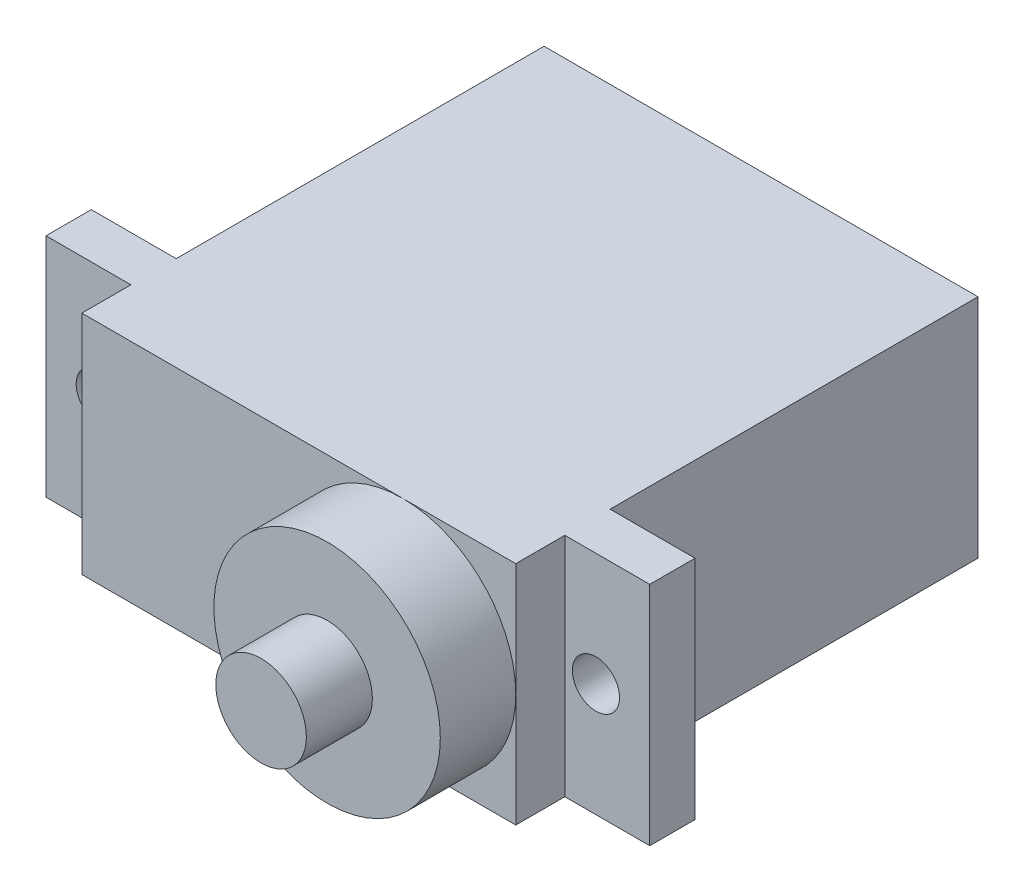
ISO-10303-21;
HEADER;
FILE_DESCRIPTION(('STEP AP214'),'2;1');
FILE_NAME('part.step','',(''),(''),'','','');
FILE_SCHEMA(('AUTOMOTIVE_DESIGN { 1 0 10303 214 1 1 1 1 }'));
ENDSEC;
DATA;
#1=APPLICATION_CONTEXT('core data for automotive mechanical design processes');
#2=APPLICATION_PROTOCOL_DEFINITION('international standard','automotive_design',2000,#1);
#3=PRODUCT_CONTEXT('',#1,'mechanical');
#4=PRODUCT('Part','Part','',(#3));
#5=PRODUCT_RELATED_PRODUCT_CATEGORY('part','',(#4));
#6=PRODUCT_DEFINITION_FORMATION('','',#4);
#7=PRODUCT_DEFINITION_CONTEXT('part definition',#1,'design');
#8=PRODUCT_DEFINITION('design','',#6,#7);
#9=PRODUCT_DEFINITION_SHAPE('','',#8);
#10=(LENGTH_UNIT() NAMED_UNIT(*) SI_UNIT(.MILLI.,.METRE.));
#11=(NAMED_UNIT(*) PLANE_ANGLE_UNIT() SI_UNIT($,.RADIAN.));
#12=(NAMED_UNIT(*) SI_UNIT($,.STERADIAN.) SOLID_ANGLE_UNIT());
#13=UNCERTAINTY_MEASURE_WITH_UNIT(LENGTH_MEASURE(1.E-05),#10,'distance_accuracy_value','');
#14=(GEOMETRIC_REPRESENTATION_CONTEXT(3) GLOBAL_UNCERTAINTY_ASSIGNED_CONTEXT((#13)) GLOBAL_UNIT_ASSIGNED_CONTEXT((#10,
#11,#12)) REPRESENTATION_CONTEXT('',''));
#15=CARTESIAN_POINT('',(0.,0.,0.));
#16=DIRECTION('',(0.,0.,1.));
#17=DIRECTION('',(1.,0.,0.));
#18=AXIS2_PLACEMENT_3D('',#15,#16,#17);
#19=CARTESIAN_POINT('',(23.,0.,32.));
#20=DIRECTION('',(-1.,0.,0.));
#21=DIRECTION('',(0.,0.,1.));
#22=AXIS2_PLACEMENT_3D('',#19,#20,#21);
#23=PLANE('',#22);
#24=DIRECTION('',(0.,-1.,0.));
#25=VECTOR('',#24,1.);
#26=CARTESIAN_POINT('',(23.,0.,21.9));
#27=LINE('',#26,#25);
#28=CARTESIAN_POINT('',(23.,12.,21.9));
#29=VERTEX_POINT('',#28);
#30=CARTESIAN_POINT('',(23.,0.,21.9));
#31=VERTEX_POINT('',#30);
#32=EDGE_CURVE('E208',#29,#31,#27,.T.);
#33=ORIENTED_EDGE('',*,*,#32,.F.);
#34=DIRECTION('',(0.,0.,-1.));
#35=VECTOR('',#34,1.);
#36=CARTESIAN_POINT('',(23.,12.,32.));
#37=LINE('',#36,#35);
#38=CARTESIAN_POINT('',(23.,12.,24.5));
#39=VERTEX_POINT('',#38);
#40=EDGE_CURVE('E264',#39,#29,#37,.T.);
#41=ORIENTED_EDGE('',*,*,#40,.F.);
#42=DIRECTION('',(0.,1.,0.));
#43=VECTOR('',#42,1.);
#44=CARTESIAN_POINT('',(23.,0.,24.5));
#45=LINE('',#44,#43);
#46=CARTESIAN_POINT('',(23.,6.,24.5));
#47=VERTEX_POINT('',#46);
#48=EDGE_CURVE('E234',#47,#39,#45,.T.);
#49=ORIENTED_EDGE('',*,*,#48,.F.);
#50=DIRECTION('',(0.,1.,0.));
#51=VECTOR('',#50,1.);
#52=CARTESIAN_POINT('',(23.,0.,24.5));
#53=LINE('',#52,#51);
#54=CARTESIAN_POINT('',(23.,0.,24.5));
#55=VERTEX_POINT('',#54);
#56=EDGE_CURVE('E225',#55,#47,#53,.T.);
#57=ORIENTED_EDGE('',*,*,#56,.F.);
#58=DIRECTION('',(0.,0.,-1.));
#59=VECTOR('',#58,1.);
#60=CARTESIAN_POINT('',(23.,0.,32.));
#61=LINE('',#60,#59);
#62=EDGE_CURVE('E268',#55,#31,#61,.T.);
#63=ORIENTED_EDGE('',*,*,#62,.T.);
#64=EDGE_LOOP('',(#33,#41,#49,#57,#63));
#65=FACE_BOUND('',#64,.T.);
#66=ADVANCED_FACE('F76',(#65),#23,.F.);
#67=CARTESIAN_POINT('',(0.,0.,32.));
#68=DIRECTION('',(1.,0.,0.));
#69=DIRECTION('',(0.,0.,-1.));
#70=AXIS2_PLACEMENT_3D('',#67,#68,#69);
#71=PLANE('',#70);
#72=DIRECTION('',(0.,1.,0.));
#73=VECTOR('',#72,1.);
#74=CARTESIAN_POINT('',(0.,0.,21.9));
#75=LINE('',#74,#73);
#76=CARTESIAN_POINT('',(0.,0.,21.9));
#77=VERTEX_POINT('',#76);
#78=CARTESIAN_POINT('',(0.,12.,21.9));
#79=VERTEX_POINT('',#78);
#80=EDGE_CURVE('E12',#77,#79,#75,.T.);
#81=ORIENTED_EDGE('',*,*,#80,.F.);
#82=DIRECTION('',(0.,0.,-1.));
#83=VECTOR('',#82,1.);
#84=CARTESIAN_POINT('',(0.,0.,32.));
#85=LINE('',#84,#83);
#86=CARTESIAN_POINT('',(0.,0.,24.5));
#87=VERTEX_POINT('',#86);
#88=EDGE_CURVE('E187',#87,#77,#85,.T.);
#89=ORIENTED_EDGE('',*,*,#88,.F.);
#90=DIRECTION('',(0.,-1.,0.));
#91=VECTOR('',#90,1.);
#92=CARTESIAN_POINT('',(0.,0.,24.5));
#93=LINE('',#92,#91);
#94=CARTESIAN_POINT('',(0.,12.,24.5));
#95=VERTEX_POINT('',#94);
#96=EDGE_CURVE('E244',#95,#87,#93,.T.);
#97=ORIENTED_EDGE('',*,*,#96,.F.);
#98=DIRECTION('',(0.,0.,-1.));
#99=VECTOR('',#98,1.);
#100=CARTESIAN_POINT('',(0.,12.,32.));
#101=LINE('',#100,#99);
#102=EDGE_CURVE('E261',#95,#79,#101,.T.);
#103=ORIENTED_EDGE('',*,*,#102,.T.);
#104=EDGE_LOOP('',(#81,#89,#97,#103));
#105=FACE_BOUND('',#104,.T.);
#106=ADVANCED_FACE('F347',(#105),#71,.F.);
#107=CARTESIAN_POINT('',(17.,6.,24.5));
#108=DIRECTION('',(0.,0.,1.));
#109=DIRECTION('',(1.,0.,0.));
#110=AXIS2_PLACEMENT_3D('',#107,#108,#109);
#111=CYLINDRICAL_SURFACE('',#110,6.);
#112=CARTESIAN_POINT('',(17.,6.,24.5));
#113=DIRECTION('',(0.,0.,1.));
#114=DIRECTION('',(1.,0.,0.));
#115=AXIS2_PLACEMENT_3D('',#112,#113,#114);
#116=CIRCLE('',#115,6.);
#117=CARTESIAN_POINT('',(17.,0.,24.5));
#118=VERTEX_POINT('',#117);
#119=EDGE_CURVE('E230',#118,#47,#116,.T.);
#120=ORIENTED_EDGE('',*,*,#119,.T.);
#121=CARTESIAN_POINT('',(17.,6.,24.5));
#122=DIRECTION('',(0.,0.,1.));
#123=DIRECTION('',(1.,0.,0.));
#124=AXIS2_PLACEMENT_3D('',#121,#122,#123);
#125=CIRCLE('',#124,6.);
#126=CARTESIAN_POINT('',(17.,12.,24.5));
#127=VERTEX_POINT('',#126);
#128=EDGE_CURVE('E236',#47,#127,#125,.T.);
#129=ORIENTED_EDGE('',*,*,#128,.T.);
#130=CARTESIAN_POINT('',(17.,6.,24.5));
#131=DIRECTION('',(0.,0.,1.));
#132=DIRECTION('',(1.,0.,0.));
#133=AXIS2_PLACEMENT_3D('',#130,#131,#132);
#134=CIRCLE('',#133,6.);
#135=EDGE_CURVE('E239',#127,#118,#134,.T.);
#136=ORIENTED_EDGE('',*,*,#135,.T.);
#137=EDGE_LOOP('',(#120,#129,#136));
#138=FACE_BOUND('',#137,.T.);
#139=CARTESIAN_POINT('',(17.,6.,28.5));
#140=DIRECTION('',(0.,0.,1.));
#141=DIRECTION('',(1.,0.,0.));
#142=AXIS2_PLACEMENT_3D('',#139,#140,#141);
#143=CIRCLE('',#142,6.);
#144=CARTESIAN_POINT('',(23.,6.,28.5));
#145=VERTEX_POINT('',#144);
#146=EDGE_CURVE('E220',#145,#145,#143,.T.);
#147=ORIENTED_EDGE('',*,*,#146,.F.);
#148=EDGE_LOOP('',(#147));
#149=FACE_BOUND('',#148,.T.);
#150=ADVANCED_FACE('F340',(#138,#149),#111,.T.);
#151=CARTESIAN_POINT('',(0.,0.,32.));
#152=DIRECTION('',(0.,1.,0.));
#153=DIRECTION('',(0.,0.,1.));
#154=AXIS2_PLACEMENT_3D('',#151,#152,#153);
#155=PLANE('',#154);
#156=CARTESIAN_POINT('',(23.,0.,19.5));
#157=VERTEX_POINT('',#156);
#158=CARTESIAN_POINT('',(23.,0.,0.));
#159=VERTEX_POINT('',#158);
#160=EDGE_CURVE('E267',#157,#159,#61,.T.);
#161=ORIENTED_EDGE('',*,*,#160,.F.);
#162=DIRECTION('',(1.,0.,0.));
#163=VECTOR('',#162,1.);
#164=CARTESIAN_POINT('',(-4.5,0.,19.5));
#165=LINE('',#164,#163);
#166=CARTESIAN_POINT('',(27.5,0.,19.5));
#167=VERTEX_POINT('',#166);
#168=EDGE_CURVE('E292',#157,#167,#165,.T.);
#169=ORIENTED_EDGE('',*,*,#168,.T.);
#170=DIRECTION('',(0.,0.,-1.));
#171=VECTOR('',#170,1.);
#172=CARTESIAN_POINT('',(27.5,0.,21.9));
#173=LINE('',#172,#171);
#174=CARTESIAN_POINT('',(27.5,0.,21.9));
#175=VERTEX_POINT('',#174);
#176=EDGE_CURVE('E205',#175,#167,#173,.T.);
#177=ORIENTED_EDGE('',*,*,#176,.F.);
#178=DIRECTION('',(1.,0.,0.));
#179=VECTOR('',#178,1.);
#180=CARTESIAN_POINT('',(-4.5,0.,21.9));
#181=LINE('',#180,#179);
#182=EDGE_CURVE('E190',#31,#175,#181,.T.);
#183=ORIENTED_EDGE('',*,*,#182,.F.);
#184=ORIENTED_EDGE('',*,*,#62,.F.);
#185=DIRECTION('',(1.,0.,0.));
#186=VECTOR('',#185,1.);
#187=CARTESIAN_POINT('',(0.,0.,24.5));
#188=LINE('',#187,#186);
#189=EDGE_CURVE('E228',#118,#55,#188,.T.);
#190=ORIENTED_EDGE('',*,*,#189,.F.);
#191=DIRECTION('',(1.,0.,0.));
#192=VECTOR('',#191,1.);
#193=CARTESIAN_POINT('',(0.,0.,24.5));
#194=LINE('',#193,#192);
#195=EDGE_CURVE('E246',#87,#118,#194,.T.);
#196=ORIENTED_EDGE('',*,*,#195,.F.);
#197=ORIENTED_EDGE('',*,*,#88,.T.);
#198=CARTESIAN_POINT('',(-4.5,0.,21.9));
#199=VERTEX_POINT('',#198);
#200=EDGE_CURVE('E177',#199,#77,#181,.T.);
#201=ORIENTED_EDGE('',*,*,#200,.F.);
#202=DIRECTION('',(0.,0.,-1.));
#203=VECTOR('',#202,1.);
#204=CARTESIAN_POINT('',(-4.5,0.,21.9));
#205=LINE('',#204,#203);
#206=CARTESIAN_POINT('',(-4.5,0.,19.5));
#207=VERTEX_POINT('',#206);
#208=EDGE_CURVE('E183',#199,#207,#205,.T.);
#209=ORIENTED_EDGE('',*,*,#208,.T.);
#210=CARTESIAN_POINT('',(0.,0.,19.5));
#211=VERTEX_POINT('',#210);
#212=EDGE_CURVE('E277',#207,#211,#165,.T.);
#213=ORIENTED_EDGE('',*,*,#212,.T.);
#214=CARTESIAN_POINT('',(0.,0.,0.));
#215=VERTEX_POINT('',#214);
#216=EDGE_CURVE('E99',#211,#215,#85,.T.);
#217=ORIENTED_EDGE('',*,*,#216,.T.);
#218=DIRECTION('',(1.,0.,0.));
#219=VECTOR('',#218,1.);
#220=CARTESIAN_POINT('',(0.,0.,0.));
#221=LINE('',#220,#219);
#222=EDGE_CURVE('E251',#215,#159,#221,.T.);
#223=ORIENTED_EDGE('',*,*,#222,.T.);
#224=EDGE_LOOP('',(#161,#169,#177,#183,#184,#190,#196,#197,#201,#209,#213,#217,#223));
#225=FACE_BOUND('',#224,.T.);
#226=ADVANCED_FACE('F180',(#225),#155,.F.);
#227=CARTESIAN_POINT('',(23.,12.,19.5));
#228=VERTEX_POINT('',#227);
#229=CARTESIAN_POINT('',(23.,12.,0.));
#230=VERTEX_POINT('',#229);
#231=EDGE_CURVE('E263',#228,#230,#37,.T.);
#232=ORIENTED_EDGE('',*,*,#231,.F.);
#233=DIRECTION('',(0.,-1.,0.));
#234=VECTOR('',#233,1.);
#235=CARTESIAN_POINT('',(23.,0.,19.5));
#236=LINE('',#235,#234);
#237=EDGE_CURVE('E204',#228,#157,#236,.T.);
#238=ORIENTED_EDGE('',*,*,#237,.T.);
#239=ORIENTED_EDGE('',*,*,#160,.T.);
#240=DIRECTION('',(0.,1.,0.));
#241=VECTOR('',#240,1.);
#242=CARTESIAN_POINT('',(23.,0.,0.));
#243=LINE('',#242,#241);
#244=EDGE_CURVE('E254',#159,#230,#243,.T.);
#245=ORIENTED_EDGE('',*,*,#244,.T.);
#246=EDGE_LOOP('',(#232,#238,#239,#245));
#247=FACE_BOUND('',#246,.T.);
#248=ADVANCED_FACE('F294',(#247),#23,.F.);
#249=CARTESIAN_POINT('',(0.,12.,32.));
#250=DIRECTION('',(0.,-1.,0.));
#251=DIRECTION('',(0.,0.,-1.));
#252=AXIS2_PLACEMENT_3D('',#249,#250,#251);
#253=PLANE('',#252);
#254=CARTESIAN_POINT('',(0.,12.,19.5));
#255=VERTEX_POINT('',#254);
#256=CARTESIAN_POINT('',(0.,12.,0.));
#257=VERTEX_POINT('',#256);
#258=EDGE_CURVE('E260',#255,#257,#101,.T.);
#259=ORIENTED_EDGE('',*,*,#258,.F.);
#260=DIRECTION('',(-1.,0.,0.));
#261=VECTOR('',#260,1.);
#262=CARTESIAN_POINT('',(-4.5,12.,19.5));
#263=LINE('',#262,#261);
#264=CARTESIAN_POINT('',(-4.5,12.,19.5));
#265=VERTEX_POINT('',#264);
#266=EDGE_CURVE('E273',#255,#265,#263,.T.);
#267=ORIENTED_EDGE('',*,*,#266,.T.);
#268=DIRECTION('',(0.,0.,-1.));
#269=VECTOR('',#268,1.);
#270=CARTESIAN_POINT('',(-4.5,12.,21.9));
#271=LINE('',#270,#269);
#272=CARTESIAN_POINT('',(-4.5,12.,21.9));
#273=VERTEX_POINT('',#272);
#274=EDGE_CURVE('E281',#273,#265,#271,.T.);
#275=ORIENTED_EDGE('',*,*,#274,.F.);
#276=DIRECTION('',(-1.,0.,0.));
#277=VECTOR('',#276,1.);
#278=CARTESIAN_POINT('',(-4.5,12.,21.9));
#279=LINE('',#278,#277);
#280=EDGE_CURVE('E196',#79,#273,#279,.T.);
#281=ORIENTED_EDGE('',*,*,#280,.F.);
#282=ORIENTED_EDGE('',*,*,#102,.F.);
#283=DIRECTION('',(-1.,0.,0.));
#284=VECTOR('',#283,1.);
#285=CARTESIAN_POINT('',(0.,12.,24.5));
#286=LINE('',#285,#284);
#287=EDGE_CURVE('E242',#127,#95,#286,.T.);
#288=ORIENTED_EDGE('',*,*,#287,.F.);
#289=DIRECTION('',(-1.,0.,0.));
#290=VECTOR('',#289,1.);
#291=CARTESIAN_POINT('',(0.,12.,24.5));
#292=LINE('',#291,#290);
#293=EDGE_CURVE('E232',#39,#127,#292,.T.);
#294=ORIENTED_EDGE('',*,*,#293,.F.);
#295=ORIENTED_EDGE('',*,*,#40,.T.);
#296=CARTESIAN_POINT('',(27.5,12.,21.9));
#297=VERTEX_POINT('',#296);
#298=EDGE_CURVE('E282',#297,#29,#279,.T.);
#299=ORIENTED_EDGE('',*,*,#298,.F.);
#300=DIRECTION('',(0.,0.,-1.));
#301=VECTOR('',#300,1.);
#302=CARTESIAN_POINT('',(27.5,12.,21.9));
#303=LINE('',#302,#301);
#304=CARTESIAN_POINT('',(27.5,12.,19.5));
#305=VERTEX_POINT('',#304);
#306=EDGE_CURVE('E211',#297,#305,#303,.T.);
#307=ORIENTED_EDGE('',*,*,#306,.T.);
#308=EDGE_CURVE('E91',#305,#228,#263,.T.);
#309=ORIENTED_EDGE('',*,*,#308,.T.);
#310=ORIENTED_EDGE('',*,*,#231,.T.);
#311=DIRECTION('',(-1.,0.,0.));
#312=VECTOR('',#311,1.);
#313=CARTESIAN_POINT('',(0.,12.,0.));
#314=LINE('',#313,#312);
#315=EDGE_CURVE('E257',#230,#257,#314,.T.);
#316=ORIENTED_EDGE('',*,*,#315,.T.);
#317=EDGE_LOOP('',(#259,#267,#275,#281,#282,#288,#294,#295,#299,#307,#309,#310,#316));
#318=FACE_BOUND('',#317,.T.);
#319=ADVANCED_FACE('F285',(#318),#253,.F.);
#320=ORIENTED_EDGE('',*,*,#216,.F.);
#321=DIRECTION('',(0.,1.,0.));
#322=VECTOR('',#321,1.);
#323=CARTESIAN_POINT('',(0.,0.,19.5));
#324=LINE('',#323,#322);
#325=EDGE_CURVE('E84',#211,#255,#324,.T.);
#326=ORIENTED_EDGE('',*,*,#325,.T.);
#327=ORIENTED_EDGE('',*,*,#258,.T.);
#328=DIRECTION('',(0.,-1.,0.));
#329=VECTOR('',#328,1.);
#330=CARTESIAN_POINT('',(0.,0.,0.));
#331=LINE('',#330,#329);
#332=EDGE_CURVE('E249',#257,#215,#331,.T.);
#333=ORIENTED_EDGE('',*,*,#332,.T.);
#334=EDGE_LOOP('',(#320,#326,#327,#333));
#335=FACE_BOUND('',#334,.T.);
#336=ADVANCED_FACE('F78',(#335),#71,.F.);
#337=CARTESIAN_POINT('',(0.,0.,0.));
#338=DIRECTION('',(0.,0.,-1.));
#339=DIRECTION('',(-1.,0.,0.));
#340=AXIS2_PLACEMENT_3D('',#337,#338,#339);
#341=PLANE('',#340);
#342=ORIENTED_EDGE('',*,*,#332,.F.);
#343=ORIENTED_EDGE('',*,*,#315,.F.);
#344=ORIENTED_EDGE('',*,*,#244,.F.);
#345=ORIENTED_EDGE('',*,*,#222,.F.);
#346=EDGE_LOOP('',(#342,#343,#344,#345));
#347=FACE_BOUND('',#346,.T.);
#348=ADVANCED_FACE('F300',(#347),#341,.T.);
#349=CARTESIAN_POINT('',(0.,0.,24.5));
#350=DIRECTION('',(0.,0.,1.));
#351=DIRECTION('',(1.,0.,0.));
#352=AXIS2_PLACEMENT_3D('',#349,#350,#351);
#353=PLANE('',#352);
#354=ORIENTED_EDGE('',*,*,#135,.F.);
#355=ORIENTED_EDGE('',*,*,#287,.T.);
#356=ORIENTED_EDGE('',*,*,#96,.T.);
#357=ORIENTED_EDGE('',*,*,#195,.T.);
#358=EDGE_LOOP('',(#354,#355,#356,#357));
#359=FACE_BOUND('',#358,.T.);
#360=ADVANCED_FACE('F343',(#359),#353,.T.);
#361=CARTESIAN_POINT('',(0.,0.,24.5));
#362=DIRECTION('',(0.,0.,1.));
#363=DIRECTION('',(1.,0.,0.));
#364=AXIS2_PLACEMENT_3D('',#361,#362,#363);
#365=PLANE('',#364);
#366=ORIENTED_EDGE('',*,*,#128,.F.);
#367=ORIENTED_EDGE('',*,*,#48,.T.);
#368=ORIENTED_EDGE('',*,*,#293,.T.);
#369=EDGE_LOOP('',(#366,#367,#368));
#370=FACE_BOUND('',#369,.T.);
#371=ADVANCED_FACE('F337',(#370),#365,.T.);
#372=CARTESIAN_POINT('',(0.,0.,24.5));
#373=DIRECTION('',(0.,0.,1.));
#374=DIRECTION('',(1.,0.,0.));
#375=AXIS2_PLACEMENT_3D('',#372,#373,#374);
#376=PLANE('',#375);
#377=ORIENTED_EDGE('',*,*,#119,.F.);
#378=ORIENTED_EDGE('',*,*,#189,.T.);
#379=ORIENTED_EDGE('',*,*,#56,.T.);
#380=EDGE_LOOP('',(#377,#378,#379));
#381=FACE_BOUND('',#380,.T.);
#382=ADVANCED_FACE('F466',(#381),#376,.T.);
#383=CARTESIAN_POINT('',(17.,6.,28.5));
#384=DIRECTION('',(0.,0.,1.));
#385=DIRECTION('',(1.,0.,0.));
#386=AXIS2_PLACEMENT_3D('',#383,#384,#385);
#387=PLANE('',#386);
#388=CARTESIAN_POINT('',(17.,6.,28.5));
#389=DIRECTION('',(0.,0.,1.));
#390=DIRECTION('',(1.,0.,0.));
#391=AXIS2_PLACEMENT_3D('',#388,#389,#390);
#392=CIRCLE('',#391,2.4);
#393=CARTESIAN_POINT('',(19.4,6.,28.5));
#394=VERTEX_POINT('',#393);
#395=EDGE_CURVE('E217',#394,#394,#392,.T.);
#396=ORIENTED_EDGE('',*,*,#395,.F.);
#397=EDGE_LOOP('',(#396));
#398=FACE_BOUND('',#397,.T.);
#399=ORIENTED_EDGE('',*,*,#146,.T.);
#400=EDGE_LOOP('',(#399));
#401=FACE_BOUND('',#400,.T.);
#402=ADVANCED_FACE('F462',(#398,#401),#387,.T.);
#403=CARTESIAN_POINT('',(17.,6.,28.5));
#404=DIRECTION('',(0.,0.,1.));
#405=DIRECTION('',(1.,0.,0.));
#406=AXIS2_PLACEMENT_3D('',#403,#404,#405);
#407=CYLINDRICAL_SURFACE('',#406,2.4);
#408=ORIENTED_EDGE('',*,*,#395,.T.);
#409=EDGE_LOOP('',(#408));
#410=FACE_BOUND('',#409,.T.);
#411=CARTESIAN_POINT('',(17.,6.,32.));
#412=DIRECTION('',(0.,0.,1.));
#413=DIRECTION('',(1.,0.,0.));
#414=AXIS2_PLACEMENT_3D('',#411,#412,#413);
#415=CIRCLE('',#414,2.4);
#416=CARTESIAN_POINT('',(19.4,6.,32.));
#417=VERTEX_POINT('',#416);
#418=EDGE_CURVE('E216',#417,#417,#415,.T.);
#419=ORIENTED_EDGE('',*,*,#418,.F.);
#420=EDGE_LOOP('',(#419));
#421=FACE_BOUND('',#420,.T.);
#422=ADVANCED_FACE('F459',(#410,#421),#407,.T.);
#423=CARTESIAN_POINT('',(0.,0.,32.));
#424=DIRECTION('',(0.,0.,-1.));
#425=DIRECTION('',(-1.,0.,0.));
#426=AXIS2_PLACEMENT_3D('',#423,#424,#425);
#427=PLANE('',#426);
#428=ORIENTED_EDGE('',*,*,#418,.T.);
#429=EDGE_LOOP('',(#428));
#430=FACE_BOUND('',#429,.T.);
#431=ADVANCED_FACE('F396',(#430),#427,.F.);
#432=CARTESIAN_POINT('',(-1.65,6.,21.9));
#433=DIRECTION('',(0.,0.,-1.));
#434=DIRECTION('',(-1.,0.,0.));
#435=AXIS2_PLACEMENT_3D('',#432,#433,#434);
#436=CYLINDRICAL_SURFACE('',#435,1.25);
#437=CARTESIAN_POINT('',(-1.65,6.,21.9));
#438=DIRECTION('',(0.,0.,1.));
#439=DIRECTION('',(1.,0.,0.));
#440=AXIS2_PLACEMENT_3D('',#437,#438,#439);
#441=CIRCLE('',#440,1.25);
#442=CARTESIAN_POINT('',(-0.4,6.,21.9));
#443=VERTEX_POINT('',#442);
#444=EDGE_CURVE('E303',#443,#443,#441,.T.);
#445=ORIENTED_EDGE('',*,*,#444,.T.);
#446=EDGE_LOOP('',(#445));
#447=FACE_BOUND('',#446,.T.);
#448=CARTESIAN_POINT('',(-1.65,6.,19.5));
#449=DIRECTION('',(0.,0.,1.));
#450=DIRECTION('',(1.,0.,0.));
#451=AXIS2_PLACEMENT_3D('',#448,#449,#450);
#452=CIRCLE('',#451,1.25);
#453=CARTESIAN_POINT('',(-0.4,6.,19.5));
#454=VERTEX_POINT('',#453);
#455=EDGE_CURVE('E306',#454,#454,#452,.T.);
#456=ORIENTED_EDGE('',*,*,#455,.F.);
#457=EDGE_LOOP('',(#456));
#458=FACE_BOUND('',#457,.T.);
#459=ADVANCED_FACE('F392',(#447,#458),#436,.F.);
#460=CARTESIAN_POINT('',(-4.5,0.,21.9));
#461=DIRECTION('',(1.,0.,0.));
#462=DIRECTION('',(0.,0.,-1.));
#463=AXIS2_PLACEMENT_3D('',#460,#461,#462);
#464=PLANE('',#463);
#465=DIRECTION('',(0.,-1.,0.));
#466=VECTOR('',#465,1.);
#467=CARTESIAN_POINT('',(-4.5,0.,19.5));
#468=LINE('',#467,#466);
#469=EDGE_CURVE('E203',#265,#207,#468,.T.);
#470=ORIENTED_EDGE('',*,*,#469,.T.);
#471=ORIENTED_EDGE('',*,*,#208,.F.);
#472=DIRECTION('',(0.,-1.,0.));
#473=VECTOR('',#472,1.);
#474=CARTESIAN_POINT('',(-4.5,0.,21.9));
#475=LINE('',#474,#473);
#476=EDGE_CURVE('E193',#273,#199,#475,.T.);
#477=ORIENTED_EDGE('',*,*,#476,.F.);
#478=ORIENTED_EDGE('',*,*,#274,.T.);
#479=EDGE_LOOP('',(#470,#471,#477,#478));
#480=FACE_BOUND('',#479,.T.);
#481=ADVANCED_FACE('F201',(#480),#464,.F.);
#482=CARTESIAN_POINT('',(0.,0.,19.5));
#483=DIRECTION('',(0.,0.,-1.));
#484=DIRECTION('',(-1.,0.,0.));
#485=AXIS2_PLACEMENT_3D('',#482,#483,#484);
#486=PLANE('',#485);
#487=ORIENTED_EDGE('',*,*,#455,.T.);
#488=EDGE_LOOP('',(#487));
#489=FACE_BOUND('',#488,.T.);
#490=ORIENTED_EDGE('',*,*,#325,.F.);
#491=ORIENTED_EDGE('',*,*,#212,.F.);
#492=ORIENTED_EDGE('',*,*,#469,.F.);
#493=ORIENTED_EDGE('',*,*,#266,.F.);
#494=EDGE_LOOP('',(#490,#491,#492,#493));
#495=FACE_BOUND('',#494,.T.);
#496=ADVANCED_FACE('F274',(#489,#495),#486,.T.);
#497=CARTESIAN_POINT('',(0.,0.,21.9));
#498=DIRECTION('',(0.,0.,-1.));
#499=DIRECTION('',(-1.,0.,0.));
#500=AXIS2_PLACEMENT_3D('',#497,#498,#499);
#501=PLANE('',#500);
#502=ORIENTED_EDGE('',*,*,#444,.F.);
#503=EDGE_LOOP('',(#502));
#504=FACE_BOUND('',#503,.T.);
#505=ORIENTED_EDGE('',*,*,#200,.T.);
#506=ORIENTED_EDGE('',*,*,#80,.T.);
#507=ORIENTED_EDGE('',*,*,#280,.T.);
#508=ORIENTED_EDGE('',*,*,#476,.T.);
#509=EDGE_LOOP('',(#505,#506,#507,#508));
#510=FACE_BOUND('',#509,.T.);
#511=ADVANCED_FACE('F194',(#504,#510),#501,.F.);
#512=CARTESIAN_POINT('',(24.65,6.,21.9));
#513=DIRECTION('',(0.,0.,1.));
#514=DIRECTION('',(1.,0.,0.));
#515=AXIS2_PLACEMENT_3D('',#512,#513,#514);
#516=CIRCLE('',#515,1.25);
#517=CARTESIAN_POINT('',(25.9,6.,21.9));
#518=VERTEX_POINT('',#517);
#519=EDGE_CURVE('E309',#518,#518,#516,.T.);
#520=ORIENTED_EDGE('',*,*,#519,.F.);
#521=EDGE_LOOP('',(#520));
#522=FACE_BOUND('',#521,.T.);
#523=ORIENTED_EDGE('',*,*,#298,.T.);
#524=ORIENTED_EDGE('',*,*,#32,.T.);
#525=ORIENTED_EDGE('',*,*,#182,.T.);
#526=DIRECTION('',(0.,1.,0.));
#527=VECTOR('',#526,1.);
#528=CARTESIAN_POINT('',(27.5,0.,21.9));
#529=LINE('',#528,#527);
#530=EDGE_CURVE('E189',#175,#297,#529,.T.);
#531=ORIENTED_EDGE('',*,*,#530,.T.);
#532=EDGE_LOOP('',(#523,#524,#525,#531));
#533=FACE_BOUND('',#532,.T.);
#534=ADVANCED_FACE('F321',(#522,#533),#501,.F.);
#535=CARTESIAN_POINT('',(24.65,6.,19.5));
#536=DIRECTION('',(0.,0.,1.));
#537=DIRECTION('',(1.,0.,0.));
#538=AXIS2_PLACEMENT_3D('',#535,#536,#537);
#539=CIRCLE('',#538,1.25);
#540=CARTESIAN_POINT('',(25.9,6.,19.5));
#541=VERTEX_POINT('',#540);
#542=EDGE_CURVE('E312',#541,#541,#539,.T.);
#543=ORIENTED_EDGE('',*,*,#542,.T.);
#544=EDGE_LOOP('',(#543));
#545=FACE_BOUND('',#544,.T.);
#546=ORIENTED_EDGE('',*,*,#237,.F.);
#547=ORIENTED_EDGE('',*,*,#308,.F.);
#548=DIRECTION('',(0.,1.,0.));
#549=VECTOR('',#548,1.);
#550=CARTESIAN_POINT('',(27.5,0.,19.5));
#551=LINE('',#550,#549);
#552=EDGE_CURVE('E275',#167,#305,#551,.T.);
#553=ORIENTED_EDGE('',*,*,#552,.F.);
#554=ORIENTED_EDGE('',*,*,#168,.F.);
#555=EDGE_LOOP('',(#546,#547,#553,#554));
#556=FACE_BOUND('',#555,.T.);
#557=ADVANCED_FACE('F290',(#545,#556),#486,.T.);
#558=CARTESIAN_POINT('',(27.5,0.,21.9));
#559=DIRECTION('',(-1.,0.,0.));
#560=DIRECTION('',(0.,0.,1.));
#561=AXIS2_PLACEMENT_3D('',#558,#559,#560);
#562=PLANE('',#561);
#563=ORIENTED_EDGE('',*,*,#552,.T.);
#564=ORIENTED_EDGE('',*,*,#306,.F.);
#565=ORIENTED_EDGE('',*,*,#530,.F.);
#566=ORIENTED_EDGE('',*,*,#176,.T.);
#567=EDGE_LOOP('',(#563,#564,#565,#566));
#568=FACE_BOUND('',#567,.T.);
#569=ADVANCED_FACE('F438',(#568),#562,.F.);
#570=CARTESIAN_POINT('',(24.65,6.,21.9));
#571=DIRECTION('',(0.,0.,-1.));
#572=DIRECTION('',(-1.,0.,0.));
#573=AXIS2_PLACEMENT_3D('',#570,#571,#572);
#574=CYLINDRICAL_SURFACE('',#573,1.25);
#575=ORIENTED_EDGE('',*,*,#519,.T.);
#576=EDGE_LOOP('',(#575));
#577=FACE_BOUND('',#576,.T.);
#578=ORIENTED_EDGE('',*,*,#542,.F.);
#579=EDGE_LOOP('',(#578));
#580=FACE_BOUND('',#579,.T.);
#581=ADVANCED_FACE('F318',(#577,#580),#574,.F.);
#582=CLOSED_SHELL('',(#66,#106,#150,#226,#248,#319,#336,#348,#360,#371,#382,#402,#422,#431,#459,
#481,#496,#511,#534,#557,#569,#581));
#583=MANIFOLD_SOLID_BREP('B2',#582);
#584=ADVANCED_BREP_SHAPE_REPRESENTATION('',(#18,#583),#14);
#585=SHAPE_DEFINITION_REPRESENTATION(#9,#584);
ENDSEC;
END-ISO-10303-21;
